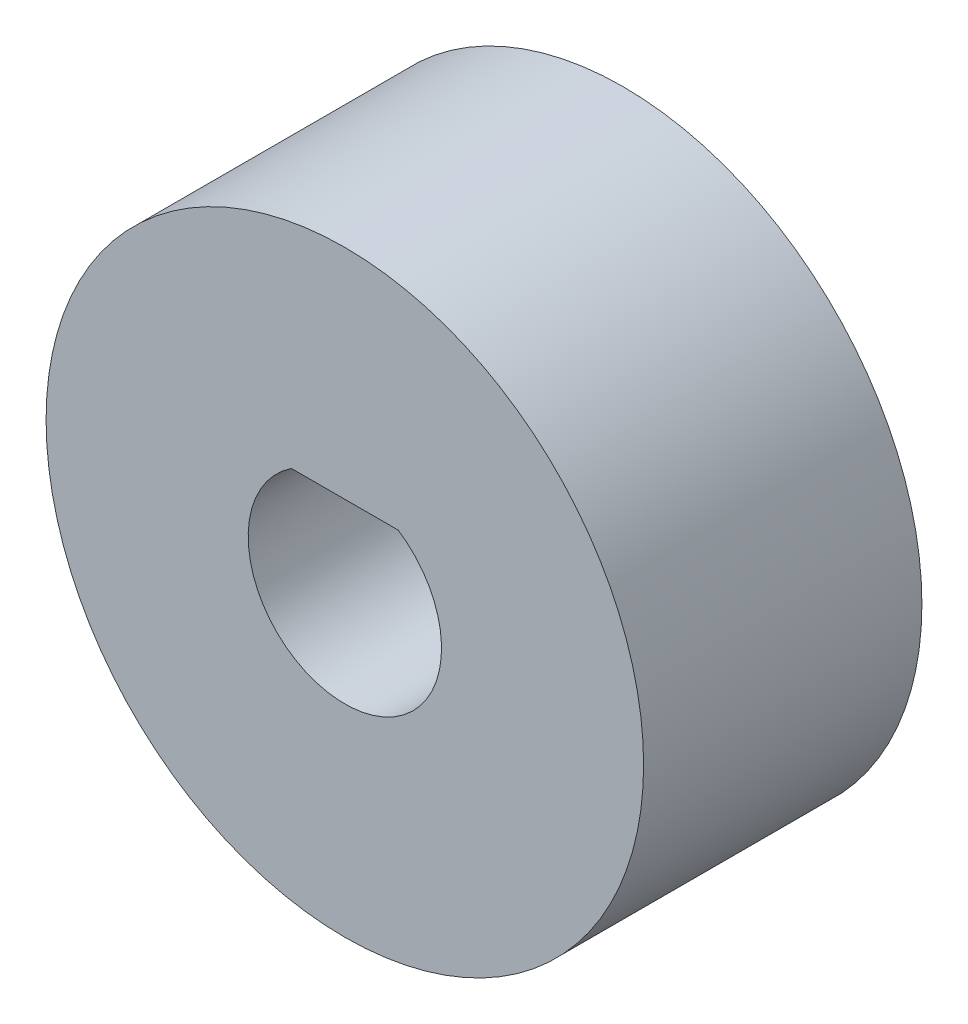
ISO-10303-21;
HEADER;
FILE_DESCRIPTION(('STEP AP214'),'2;1');
FILE_NAME('part.step','',(''),(''),'','','');
FILE_SCHEMA(('AUTOMOTIVE_DESIGN { 1 0 10303 214 1 1 1 1 }'));
ENDSEC;
DATA;
#1=APPLICATION_CONTEXT('core data for automotive mechanical design processes');
#2=APPLICATION_PROTOCOL_DEFINITION('international standard','automotive_design',2000,#1);
#3=PRODUCT_CONTEXT('',#1,'mechanical');
#4=PRODUCT('Part','Part','',(#3));
#5=PRODUCT_RELATED_PRODUCT_CATEGORY('part','',(#4));
#6=PRODUCT_DEFINITION_FORMATION('','',#4);
#7=PRODUCT_DEFINITION_CONTEXT('part definition',#1,'design');
#8=PRODUCT_DEFINITION('design','',#6,#7);
#9=PRODUCT_DEFINITION_SHAPE('','',#8);
#10=(LENGTH_UNIT() NAMED_UNIT(*) SI_UNIT(.MILLI.,.METRE.));
#11=(NAMED_UNIT(*) PLANE_ANGLE_UNIT() SI_UNIT($,.RADIAN.));
#12=(NAMED_UNIT(*) SI_UNIT($,.STERADIAN.) SOLID_ANGLE_UNIT());
#13=UNCERTAINTY_MEASURE_WITH_UNIT(LENGTH_MEASURE(1.E-05),#10,'distance_accuracy_value','');
#14=(GEOMETRIC_REPRESENTATION_CONTEXT(3) GLOBAL_UNCERTAINTY_ASSIGNED_CONTEXT((#13)) GLOBAL_UNIT_ASSIGNED_CONTEXT((#10,
#11,#12)) REPRESENTATION_CONTEXT('',''));
#15=CARTESIAN_POINT('',(0.,0.,0.));
#16=DIRECTION('',(0.,0.,1.));
#17=DIRECTION('',(1.,0.,0.));
#18=AXIS2_PLACEMENT_3D('',#15,#16,#17);
#19=CARTESIAN_POINT('',(0.,0.,8.636));
#20=DIRECTION('',(0.,0.,1.));
#21=DIRECTION('',(1.,0.,0.));
#22=AXIS2_PLACEMENT_3D('',#19,#20,#21);
#23=PLANE('',#22);
#24=CARTESIAN_POINT('',(0.,0.,8.636));
#25=DIRECTION('',(0.,0.,1.));
#26=DIRECTION('',(1.,0.,0.));
#27=AXIS2_PLACEMENT_3D('',#24,#25,#26);
#28=CIRCLE('',#27,9.271);
#29=CARTESIAN_POINT('',(9.271,0.,8.636));
#30=VERTEX_POINT('',#29);
#31=EDGE_CURVE('E11',#30,#30,#28,.T.);
#32=ORIENTED_EDGE('',*,*,#31,.T.);
#33=EDGE_LOOP('',(#32));
#34=FACE_BOUND('',#33,.T.);
#35=DIRECTION('',(-1.,0.,0.));
#36=VECTOR('',#35,1.);
#37=CARTESIAN_POINT('',(1.65831058610865,2.499994,8.636));
#38=LINE('',#37,#36);
#39=CARTESIAN_POINT('',(1.65831058610865,2.499994,8.636));
#40=VERTEX_POINT('',#39);
#41=CARTESIAN_POINT('',(-1.65831058610865,2.499994,8.636));
#42=VERTEX_POINT('',#41);
#43=EDGE_CURVE('E74',#40,#42,#38,.T.);
#44=ORIENTED_EDGE('',*,*,#43,.F.);
#45=CARTESIAN_POINT('',(0.,0.,8.636));
#46=DIRECTION('',(0.,0.,1.));
#47=DIRECTION('',(1.,0.,0.));
#48=AXIS2_PLACEMENT_3D('',#45,#46,#47);
#49=CIRCLE('',#48,2.999994);
#50=EDGE_CURVE('E65',#42,#40,#49,.T.);
#51=ORIENTED_EDGE('',*,*,#50,.F.);
#52=EDGE_LOOP('',(#44,#51));
#53=FACE_BOUND('',#52,.T.);
#54=ADVANCED_FACE('F33',(#34,#53),#23,.T.);
#55=CARTESIAN_POINT('',(0.,0.,0.));
#56=DIRECTION('',(0.,0.,1.));
#57=DIRECTION('',(1.,0.,0.));
#58=AXIS2_PLACEMENT_3D('',#55,#56,#57);
#59=PLANE('',#58);
#60=CARTESIAN_POINT('',(0.,0.,0.));
#61=DIRECTION('',(0.,0.,1.));
#62=DIRECTION('',(1.,0.,0.));
#63=AXIS2_PLACEMENT_3D('',#60,#61,#62);
#64=CIRCLE('',#63,9.271);
#65=CARTESIAN_POINT('',(9.271,0.,0.));
#66=VERTEX_POINT('',#65);
#67=EDGE_CURVE('E37',#66,#66,#64,.T.);
#68=ORIENTED_EDGE('',*,*,#67,.F.);
#69=EDGE_LOOP('',(#68));
#70=FACE_BOUND('',#69,.T.);
#71=CARTESIAN_POINT('',(0.,0.,0.));
#72=DIRECTION('',(0.,0.,1.));
#73=DIRECTION('',(1.,0.,0.));
#74=AXIS2_PLACEMENT_3D('',#71,#72,#73);
#75=CIRCLE('',#74,2.999994);
#76=CARTESIAN_POINT('',(-1.65831058610865,2.499994,0.));
#77=VERTEX_POINT('',#76);
#78=CARTESIAN_POINT('',(1.65831058610865,2.499994,0.));
#79=VERTEX_POINT('',#78);
#80=EDGE_CURVE('E55',#77,#79,#75,.T.);
#81=ORIENTED_EDGE('',*,*,#80,.T.);
#82=DIRECTION('',(-1.,0.,0.));
#83=VECTOR('',#82,1.);
#84=CARTESIAN_POINT('',(1.65831058610865,2.499994,0.));
#85=LINE('',#84,#83);
#86=EDGE_CURVE('E61',#79,#77,#85,.T.);
#87=ORIENTED_EDGE('',*,*,#86,.T.);
#88=EDGE_LOOP('',(#81,#87));
#89=FACE_BOUND('',#88,.T.);
#90=ADVANCED_FACE('F71',(#70,#89),#59,.F.);
#91=CARTESIAN_POINT('',(0.,0.,8.636));
#92=DIRECTION('',(0.,0.,-1.));
#93=DIRECTION('',(-1.,0.,0.));
#94=AXIS2_PLACEMENT_3D('',#91,#92,#93);
#95=CYLINDRICAL_SURFACE('',#94,9.271);
#96=ORIENTED_EDGE('',*,*,#31,.F.);
#97=EDGE_LOOP('',(#96));
#98=FACE_BOUND('',#97,.T.);
#99=ORIENTED_EDGE('',*,*,#67,.T.);
#100=EDGE_LOOP('',(#99));
#101=FACE_BOUND('',#100,.T.);
#102=ADVANCED_FACE('F35',(#98,#101),#95,.T.);
#103=CARTESIAN_POINT('',(0.,0.,8.636));
#104=DIRECTION('',(0.,0.,-1.));
#105=DIRECTION('',(-1.,0.,0.));
#106=AXIS2_PLACEMENT_3D('',#103,#104,#105);
#107=CYLINDRICAL_SURFACE('',#106,2.999994);
#108=ORIENTED_EDGE('',*,*,#80,.F.);
#109=DIRECTION('',(0.,0.,-1.));
#110=VECTOR('',#109,1.);
#111=CARTESIAN_POINT('',(-1.65831058610865,2.499994,8.636));
#112=LINE('',#111,#110);
#113=EDGE_CURVE('E63',#42,#77,#112,.T.);
#114=ORIENTED_EDGE('',*,*,#113,.F.);
#115=ORIENTED_EDGE('',*,*,#50,.T.);
#116=DIRECTION('',(0.,0.,-1.));
#117=VECTOR('',#116,1.);
#118=CARTESIAN_POINT('',(1.65831058610865,2.499994,8.636));
#119=LINE('',#118,#117);
#120=EDGE_CURVE('E48',#40,#79,#119,.T.);
#121=ORIENTED_EDGE('',*,*,#120,.T.);
#122=EDGE_LOOP('',(#108,#114,#115,#121));
#123=FACE_BOUND('',#122,.T.);
#124=ADVANCED_FACE('F67',(#123),#107,.F.);
#125=CARTESIAN_POINT('',(1.65831058610865,2.499994,8.636));
#126=DIRECTION('',(0.,-1.,0.));
#127=DIRECTION('',(1.,0.,0.));
#128=AXIS2_PLACEMENT_3D('',#125,#126,#127);
#129=PLANE('',#128);
#130=ORIENTED_EDGE('',*,*,#86,.F.);
#131=ORIENTED_EDGE('',*,*,#120,.F.);
#132=ORIENTED_EDGE('',*,*,#43,.T.);
#133=ORIENTED_EDGE('',*,*,#113,.T.);
#134=EDGE_LOOP('',(#130,#131,#132,#133));
#135=FACE_BOUND('',#134,.T.);
#136=ADVANCED_FACE('F62',(#135),#129,.T.);
#137=CLOSED_SHELL('',(#54,#90,#102,#124,#136));
#138=MANIFOLD_SOLID_BREP('B2',#137);
#139=ADVANCED_BREP_SHAPE_REPRESENTATION('',(#18,#138),#14);
#140=SHAPE_DEFINITION_REPRESENTATION(#9,#139);
ENDSEC;
END-ISO-10303-21;
